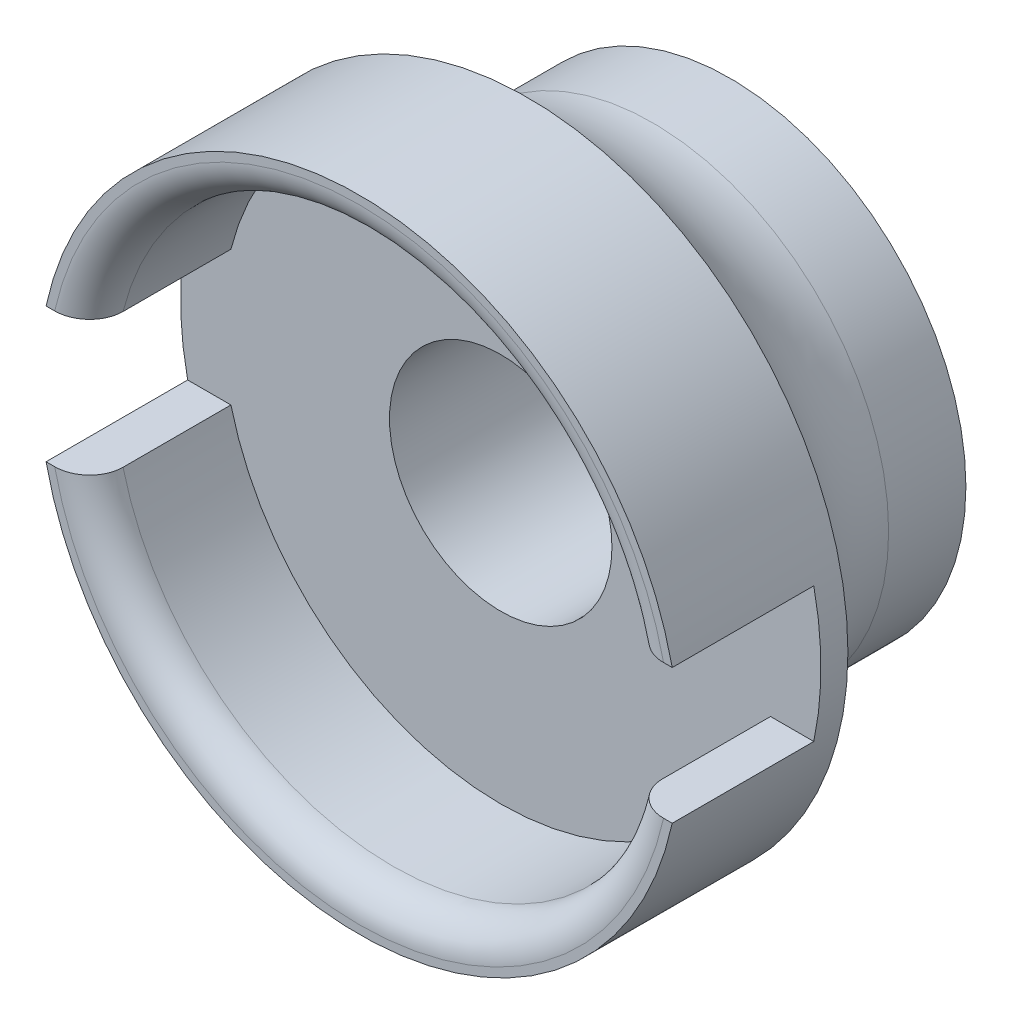
ISO-10303-21;
HEADER;
FILE_DESCRIPTION(('STEP AP214'),'2;1');
FILE_NAME('part.step','',(''),(''),'','','');
FILE_SCHEMA(('AUTOMOTIVE_DESIGN { 1 0 10303 214 1 1 1 1 }'));
ENDSEC;
DATA;
#1=APPLICATION_CONTEXT('core data for automotive mechanical design processes');
#2=APPLICATION_PROTOCOL_DEFINITION('international standard','automotive_design',2000,#1);
#3=PRODUCT_CONTEXT('',#1,'mechanical');
#4=PRODUCT('Part','Part','',(#3));
#5=PRODUCT_RELATED_PRODUCT_CATEGORY('part','',(#4));
#6=PRODUCT_DEFINITION_FORMATION('','',#4);
#7=PRODUCT_DEFINITION_CONTEXT('part definition',#1,'design');
#8=PRODUCT_DEFINITION('design','',#6,#7);
#9=PRODUCT_DEFINITION_SHAPE('','',#8);
#10=(LENGTH_UNIT() NAMED_UNIT(*) SI_UNIT(.MILLI.,.METRE.));
#11=(NAMED_UNIT(*) PLANE_ANGLE_UNIT() SI_UNIT($,.RADIAN.));
#12=(NAMED_UNIT(*) SI_UNIT($,.STERADIAN.) SOLID_ANGLE_UNIT());
#13=UNCERTAINTY_MEASURE_WITH_UNIT(LENGTH_MEASURE(1.E-05),#10,'distance_accuracy_value','');
#14=(GEOMETRIC_REPRESENTATION_CONTEXT(3) GLOBAL_UNCERTAINTY_ASSIGNED_CONTEXT((#13)) GLOBAL_UNIT_ASSIGNED_CONTEXT((#10,
#11,#12)) REPRESENTATION_CONTEXT('',''));
#15=CARTESIAN_POINT('',(0.,0.,0.));
#16=DIRECTION('',(0.,0.,1.));
#17=DIRECTION('',(1.,0.,0.));
#18=AXIS2_PLACEMENT_3D('',#15,#16,#17);
#19=CARTESIAN_POINT('',(0.,0.,3.5));
#20=DIRECTION('',(0.,0.,-1.));
#21=DIRECTION('',(-1.,0.,0.));
#22=AXIS2_PLACEMENT_3D('',#19,#20,#21);
#23=CYLINDRICAL_SURFACE('',#22,4.75);
#24=CARTESIAN_POINT('',(0.,0.,1.));
#25=DIRECTION('',(0.,0.,1.));
#26=DIRECTION('',(1.,0.,0.));
#27=AXIS2_PLACEMENT_3D('',#24,#25,#26);
#28=CIRCLE('',#27,4.75);
#29=CARTESIAN_POINT('',(4.75,0.,1.));
#30=VERTEX_POINT('',#29);
#31=EDGE_CURVE('E173',#30,#30,#28,.T.);
#32=ORIENTED_EDGE('',*,*,#31,.T.);
#33=EDGE_LOOP('',(#32));
#34=FACE_BOUND('',#33,.T.);
#35=DIRECTION('',(0.,0.,-1.));
#36=VECTOR('',#35,1.);
#37=CARTESIAN_POINT('',(-4.64354390525168,1.,3.5));
#38=LINE('',#37,#36);
#39=CARTESIAN_POINT('',(-4.64354390525168,1.,3.5));
#40=VERTEX_POINT('',#39);
#41=CARTESIAN_POINT('',(-4.64354390525168,1.,1.4));
#42=VERTEX_POINT('',#41);
#43=EDGE_CURVE('E166',#40,#42,#38,.T.);
#44=ORIENTED_EDGE('',*,*,#43,.F.);
#45=CARTESIAN_POINT('',(0.,0.,3.5));
#46=DIRECTION('',(0.,0.,1.));
#47=DIRECTION('',(1.,0.,0.));
#48=AXIS2_PLACEMENT_3D('',#45,#46,#47);
#49=CIRCLE('',#48,4.75);
#50=CARTESIAN_POINT('',(4.64354390525168,1.,3.5));
#51=VERTEX_POINT('',#50);
#52=EDGE_CURVE('E175',#51,#40,#49,.T.);
#53=ORIENTED_EDGE('',*,*,#52,.F.);
#54=DIRECTION('',(0.,0.,-1.));
#55=VECTOR('',#54,1.);
#56=CARTESIAN_POINT('',(4.64354390525168,1.,3.5));
#57=LINE('',#56,#55);
#58=CARTESIAN_POINT('',(4.64354390525168,1.,1.4));
#59=VERTEX_POINT('',#58);
#60=EDGE_CURVE('E159',#59,#51,#57,.F.);
#61=ORIENTED_EDGE('',*,*,#60,.F.);
#62=CARTESIAN_POINT('',(0.,0.,1.4));
#63=DIRECTION('',(0.,0.,1.));
#64=DIRECTION('',(1.,0.,0.));
#65=AXIS2_PLACEMENT_3D('',#62,#63,#64);
#66=CIRCLE('',#65,4.75);
#67=CARTESIAN_POINT('',(4.64354390525168,-1.,1.4));
#68=VERTEX_POINT('',#67);
#69=EDGE_CURVE('E131',#68,#59,#66,.T.);
#70=ORIENTED_EDGE('',*,*,#69,.F.);
#71=DIRECTION('',(0.,0.,-1.));
#72=VECTOR('',#71,1.);
#73=CARTESIAN_POINT('',(4.64354390525168,-1.,3.5));
#74=LINE('',#73,#72);
#75=CARTESIAN_POINT('',(4.64354390525168,-1.,3.5));
#76=VERTEX_POINT('',#75);
#77=EDGE_CURVE('E256',#76,#68,#74,.T.);
#78=ORIENTED_EDGE('',*,*,#77,.F.);
#79=CARTESIAN_POINT('',(-4.64354390525168,-1.,3.5));
#80=VERTEX_POINT('',#79);
#81=EDGE_CURVE('E143',#80,#76,#49,.T.);
#82=ORIENTED_EDGE('',*,*,#81,.F.);
#83=DIRECTION('',(0.,0.,-1.));
#84=VECTOR('',#83,1.);
#85=CARTESIAN_POINT('',(-4.64354390525168,-1.,3.5));
#86=LINE('',#85,#84);
#87=CARTESIAN_POINT('',(-4.64354390525168,-1.,1.4));
#88=VERTEX_POINT('',#87);
#89=EDGE_CURVE('E134',#88,#80,#86,.F.);
#90=ORIENTED_EDGE('',*,*,#89,.F.);
#91=EDGE_CURVE('E118',#42,#88,#66,.T.);
#92=ORIENTED_EDGE('',*,*,#91,.F.);
#93=EDGE_LOOP('',(#44,#53,#61,#70,#78,#82,#90,#92));
#94=FACE_BOUND('',#93,.T.);
#95=ADVANCED_FACE('F39',(#34,#94),#23,.T.);
#96=CARTESIAN_POINT('',(0.,0.,3.5));
#97=DIRECTION('',(0.,0.,1.));
#98=DIRECTION('',(1.,0.,0.));
#99=AXIS2_PLACEMENT_3D('',#96,#97,#98);
#100=PLANE('',#99);
#101=ORIENTED_EDGE('',*,*,#52,.T.);
#102=DIRECTION('',(1.,0.,0.));
#103=VECTOR('',#102,1.);
#104=CARTESIAN_POINT('',(0.,1.,3.5));
#105=LINE('',#104,#103);
#106=CARTESIAN_POINT('',(-4.51559796704712,1.,3.50000000000016));
#107=VERTEX_POINT('',#106);
#108=EDGE_CURVE('E160',#40,#107,#105,.T.);
#109=ORIENTED_EDGE('',*,*,#108,.T.);
#110=CARTESIAN_POINT('',(0.,0.,3.5));
#111=DIRECTION('',(0.,0.,1.));
#112=DIRECTION('',(1.,0.,0.));
#113=AXIS2_PLACEMENT_3D('',#110,#111,#112);
#114=CIRCLE('',#113,4.625);
#115=CARTESIAN_POINT('',(4.51559796704711,1.,3.5));
#116=VERTEX_POINT('',#115);
#117=EDGE_CURVE('E195',#107,#116,#114,.F.);
#118=ORIENTED_EDGE('',*,*,#117,.T.);
#119=EDGE_CURVE('E149',#116,#51,#105,.T.);
#120=ORIENTED_EDGE('',*,*,#119,.T.);
#121=EDGE_LOOP('',(#101,#109,#118,#120));
#122=FACE_BOUND('',#121,.T.);
#123=ADVANCED_FACE('F279',(#122),#100,.T.);
#124=ORIENTED_EDGE('',*,*,#81,.T.);
#125=DIRECTION('',(-1.,0.,0.));
#126=VECTOR('',#125,1.);
#127=CARTESIAN_POINT('',(0.,-1.,3.5));
#128=LINE('',#127,#126);
#129=CARTESIAN_POINT('',(4.51559796704712,-1.,3.5000000000001));
#130=VERTEX_POINT('',#129);
#131=EDGE_CURVE('E152',#76,#130,#128,.T.);
#132=ORIENTED_EDGE('',*,*,#131,.T.);
#133=CARTESIAN_POINT('',(-4.51559796704711,-1.,3.5));
#134=VERTEX_POINT('',#133);
#135=EDGE_CURVE('E196',#130,#134,#114,.F.);
#136=ORIENTED_EDGE('',*,*,#135,.T.);
#137=EDGE_CURVE('E63',#134,#80,#128,.T.);
#138=ORIENTED_EDGE('',*,*,#137,.T.);
#139=EDGE_LOOP('',(#124,#132,#136,#138));
#140=FACE_BOUND('',#139,.T.);
#141=ADVANCED_FACE('F254',(#140),#100,.T.);
#142=CARTESIAN_POINT('',(0.,0.,1.4));
#143=DIRECTION('',(0.,0.,1.));
#144=DIRECTION('',(1.,0.,0.));
#145=AXIS2_PLACEMENT_3D('',#142,#143,#144);
#146=CYLINDRICAL_SURFACE('',#145,4.125);
#147=DIRECTION('',(0.,0.,1.));
#148=VECTOR('',#147,1.);
#149=CARTESIAN_POINT('',(4.00195264839553,1.,1.4));
#150=LINE('',#149,#148);
#151=CARTESIAN_POINT('',(4.00195264839553,1.,3.));
#152=VERTEX_POINT('',#151);
#153=CARTESIAN_POINT('',(4.00195264839553,1.,1.4));
#154=VERTEX_POINT('',#153);
#155=EDGE_CURVE('E145',#152,#154,#150,.F.);
#156=ORIENTED_EDGE('',*,*,#155,.F.);
#157=CARTESIAN_POINT('',(0.,0.,3.));
#158=DIRECTION('',(0.,0.,1.));
#159=DIRECTION('',(1.,0.,0.));
#160=AXIS2_PLACEMENT_3D('',#157,#158,#159);
#161=CIRCLE('',#160,4.125);
#162=CARTESIAN_POINT('',(-4.00195264839549,1.,3.));
#163=VERTEX_POINT('',#162);
#164=EDGE_CURVE('E191',#152,#163,#161,.T.);
#165=ORIENTED_EDGE('',*,*,#164,.T.);
#166=DIRECTION('',(0.,0.,1.));
#167=VECTOR('',#166,1.);
#168=CARTESIAN_POINT('',(-4.00195264839553,1.,1.4));
#169=LINE('',#168,#167);
#170=CARTESIAN_POINT('',(-4.00195264839553,1.,1.4));
#171=VERTEX_POINT('',#170);
#172=EDGE_CURVE('E163',#171,#163,#169,.T.);
#173=ORIENTED_EDGE('',*,*,#172,.F.);
#174=CARTESIAN_POINT('',(0.,0.,1.4));
#175=DIRECTION('',(0.,0.,1.));
#176=DIRECTION('',(1.,0.,0.));
#177=AXIS2_PLACEMENT_3D('',#174,#175,#176);
#178=CIRCLE('',#177,4.125);
#179=EDGE_CURVE('E170',#154,#171,#178,.T.);
#180=ORIENTED_EDGE('',*,*,#179,.F.);
#181=EDGE_LOOP('',(#156,#165,#173,#180));
#182=FACE_BOUND('',#181,.T.);
#183=ADVANCED_FACE('F275',(#182),#146,.F.);
#184=DIRECTION('',(0.,0.,1.));
#185=VECTOR('',#184,1.);
#186=CARTESIAN_POINT('',(-4.00195264839553,-1.,1.4));
#187=LINE('',#186,#185);
#188=CARTESIAN_POINT('',(-4.00195264839448,-1.,2.99999999999998));
#189=VERTEX_POINT('',#188);
#190=CARTESIAN_POINT('',(-4.00195264839553,-1.,1.4));
#191=VERTEX_POINT('',#190);
#192=EDGE_CURVE('E136',#189,#191,#187,.F.);
#193=ORIENTED_EDGE('',*,*,#192,.F.);
#194=CARTESIAN_POINT('',(4.00195264839553,-1.,3.));
#195=VERTEX_POINT('',#194);
#196=EDGE_CURVE('E190',#189,#195,#161,.T.);
#197=ORIENTED_EDGE('',*,*,#196,.T.);
#198=DIRECTION('',(0.,0.,1.));
#199=VECTOR('',#198,1.);
#200=CARTESIAN_POINT('',(4.00195264839553,-1.,1.4));
#201=LINE('',#200,#199);
#202=CARTESIAN_POINT('',(4.00195264839553,-1.,1.4));
#203=VERTEX_POINT('',#202);
#204=EDGE_CURVE('E55',#203,#195,#201,.T.);
#205=ORIENTED_EDGE('',*,*,#204,.F.);
#206=EDGE_CURVE('E174',#191,#203,#178,.T.);
#207=ORIENTED_EDGE('',*,*,#206,.F.);
#208=EDGE_LOOP('',(#193,#197,#205,#207));
#209=FACE_BOUND('',#208,.T.);
#210=ADVANCED_FACE('F286',(#209),#146,.F.);
#211=CARTESIAN_POINT('',(0.,0.,3.));
#212=DIRECTION('',(0.,0.,1.));
#213=DIRECTION('',(1.,0.,0.));
#214=AXIS2_PLACEMENT_3D('',#211,#212,#213);
#215=TOROIDAL_SURFACE('',#214,4.625,0.5);
#216=ORIENTED_EDGE('',*,*,#117,.F.);
#217=CARTESIAN_POINT('',(-4.44735008386979,1.,3.49554329501855));
#218=CARTESIAN_POINT('',(-4.41831995392989,1.,3.49173502386112));
#219=CARTESIAN_POINT('',(-4.38958815719879,1.,3.48549070914064));
#220=CARTESIAN_POINT('',(-4.33354655231218,1.,3.46828281456044));
#221=CARTESIAN_POINT('',(-4.30623850241788,1.,3.45731354744562));
#222=CARTESIAN_POINT('',(-4.25385028446689,1.,3.43092982532924));
#223=CARTESIAN_POINT('',(-4.22877044757287,1.,3.41551471101537));
#224=CARTESIAN_POINT('',(-4.181606983845,1.,3.38064147107417));
#225=CARTESIAN_POINT('',(-4.15952244489273,1.,3.36118458082503));
#226=CARTESIAN_POINT('',(-4.11931561815197,1.,3.3190359890979));
#227=CARTESIAN_POINT('',(-4.10114375117739,1.,3.2963916306581));
#228=CARTESIAN_POINT('',(-4.0689873097533,1.,3.24830037555802));
#229=CARTESIAN_POINT('',(-4.05500223230814,1.,3.22285381605352));
#230=CARTESIAN_POINT('',(-4.03202898506533,1.,3.17063597968394));
#231=CARTESIAN_POINT('',(-4.02291337588099,1.,3.14392076424631));
#232=CARTESIAN_POINT('',(-4.00941809405874,1.,3.08932048464781));
#233=CARTESIAN_POINT('',(-4.00503765665245,1.,3.06143561015223));
#234=CARTESIAN_POINT('',(-4.00121282306982,1.,3.00598648581706));
#235=CARTESIAN_POINT('',(-4.00165547016488,1.,2.97842997121876));
#236=CARTESIAN_POINT('',(-4.00718909835075,1.,2.92378925327221));
#237=CARTESIAN_POINT('',(-4.01227982419925,1.,2.89670502407232));
#238=CARTESIAN_POINT('',(-4.02689660944263,1.,2.84391952545801));
#239=CARTESIAN_POINT('',(-4.0363989010841,1.,2.81821165849272));
#240=CARTESIAN_POINT('',(-4.05952069378308,1.,2.76872130833299));
#241=CARTESIAN_POINT('',(-4.07314044808723,1.,2.74493894368166));
#242=CARTESIAN_POINT('',(-4.1043150194922,1.,2.6995685368998));
#243=CARTESIAN_POINT('',(-4.12192734166754,1.,2.67802004014529));
#244=CARTESIAN_POINT('',(-4.16043300472458,1.,2.63808849360424));
#245=CARTESIAN_POINT('',(-4.18132676867201,1.,2.61970585262287));
#246=CARTESIAN_POINT('',(-4.22640303258572,1.,2.58610185316463));
#247=CARTESIAN_POINT('',(-4.2506589609105,1.,2.57097898908153));
#248=CARTESIAN_POINT('',(-4.3013187580394,1.,2.54490704484454));
#249=CARTESIAN_POINT('',(-4.32772291510545,1.,2.53395852595329));
#250=CARTESIAN_POINT('',(-4.38261981747788,1.,2.51628624024966));
#251=CARTESIAN_POINT('',(-4.41114771292036,1.,2.50967153397427));
#252=CARTESIAN_POINT('',(-4.46890660793105,1.,2.50126756956606));
#253=CARTESIAN_POINT('',(-4.49813766309314,1.,2.4994786942512));
#254=CARTESIAN_POINT('',(-4.55680836735425,1.,2.50079017737442));
#255=CARTESIAN_POINT('',(-4.58624685574699,1.,2.5039435949053));
#256=CARTESIAN_POINT('',(-4.64417049934313,1.,2.51517514299266));
#257=CARTESIAN_POINT('',(-4.67265566205143,1.,2.52325323477087));
#258=CARTESIAN_POINT('',(-4.72768423055946,1.,2.54408167357651));
#259=CARTESIAN_POINT('',(-4.75423755153576,1.,2.55680579435189));
#260=CARTESIAN_POINT('',(-4.8047791518283,1.,2.58660699028647));
#261=CARTESIAN_POINT('',(-4.82876764887384,1.,2.6036836955353));
#262=CARTESIAN_POINT('',(-4.87304706082735,1.,2.64139615643538));
#263=CARTESIAN_POINT('',(-4.89339482151552,1.,2.66196514693468));
#264=CARTESIAN_POINT('',(-4.9302588755661,1.,2.70629062690548));
#265=CARTESIAN_POINT('',(-4.94677561892912,1.,2.73004674149168));
#266=CARTESIAN_POINT('',(-4.97514816439494,1.,2.77954065858489));
#267=CARTESIAN_POINT('',(-4.98709360186384,1.,2.80522708844339));
#268=CARTESIAN_POINT('',(-5.00642122335944,1.,2.8582628471198));
#269=CARTESIAN_POINT('',(-5.01380387546068,1.,2.88561200505003));
#270=CARTESIAN_POINT('',(-5.02368680310943,1.,2.94071966253563));
#271=CARTESIAN_POINT('',(-5.02626430676253,1.,2.96846433339734));
#272=CARTESIAN_POINT('',(-5.02669129280416,1.,3.02398934907648));
#273=CARTESIAN_POINT('',(-5.02454101673291,1.,3.05176969199896));
#274=CARTESIAN_POINT('',(-5.01561018748594,1.,3.10639007346588));
#275=CARTESIAN_POINT('',(-5.00885961655945,1.,3.13323502467713));
#276=CARTESIAN_POINT('',(-4.99096913708682,1.,3.18541896588802));
#277=CARTESIAN_POINT('',(-4.97982918045595,1.,3.21075793938651));
#278=CARTESIAN_POINT('',(-4.95343277356827,1.,3.25935657082713));
#279=CARTESIAN_POINT('',(-4.93815586349042,1.,3.28260510789544));
#280=CARTESIAN_POINT('',(-4.90396969582811,1.,3.32625432916082));
#281=CARTESIAN_POINT('',(-4.88506035776866,1.,3.34665495024616));
#282=CARTESIAN_POINT('',(-4.84385538236226,1.,3.38436022513508));
#283=CARTESIAN_POINT('',(-4.8215138808962,1.,3.40161473556679));
#284=CARTESIAN_POINT('',(-4.77429258628128,1.,3.43221931974726));
#285=CARTESIAN_POINT('',(-4.74941192898773,1.,3.44556805823725));
#286=CARTESIAN_POINT('',(-4.69727952500204,1.,3.46826739079276));
#287=CARTESIAN_POINT('',(-4.66998946127678,1.,3.47752985379119));
#288=CARTESIAN_POINT('',(-4.61427816290542,1.,3.49142364482827));
#289=CARTESIAN_POINT('',(-4.58585814980353,1.,3.49605983980937));
#290=CARTESIAN_POINT('',(-4.5389631655515,1.,3.4998020446121));
#291=CARTESIAN_POINT('',(-4.52058759198285,1.,3.50029731424312));
#292=CARTESIAN_POINT('',(-4.4838855812283,1.,3.49936231410033));
#293=CARTESIAN_POINT('',(-4.46555914462682,1.,3.49793202152541));
#294=CARTESIAN_POINT('',(-4.44735008386979,1.,3.49554329501855));
#295=B_SPLINE_CURVE_WITH_KNOTS('',3,(#217,#218,#219,#220,#221,#222,#223,#224,#225,#226,#227,
#228,#229,#230,#231,#232,#233,#234,#235,#236,#237,#238,#239,#240,#241,#242,#243,#244,#245,#246,
#247,#248,#249,#250,#251,#252,#253,#254,#255,#256,#257,#258,#259,#260,#261,#262,#263,#264,#265,
#266,#267,#268,#269,#270,#271,#272,#273,#274,#275,#276,#277,#278,#279,#280,#281,#282,#283,#284,
#285,#286,#287,#288,#289,#290,#291,#292,#293,#294),.UNSPECIFIED.,.T.,.F.,(4,2,2,2,2,2,2,2,2,2,2,
2,2,2,2,2,2,2,2,2,2,2,2,2,2,2,2,2,2,2,2,2,2,2,2,2,2,2,4),(0.,0.087770438648908,
0.175646819931792,0.263536239854041,0.351398835594493,0.438072317631273,0.524735382641985,
0.609002895190719,0.693256795823272,0.775541792295173,0.857822270480779,0.93966450887402,
1.02151178204054,1.10462265058356,1.18774424315272,1.27310489099955,1.35847701198985,
1.44592249223388,1.53337490904803,1.62177264096718,1.71016967682648,1.79807524762778,
1.88597335014294,1.97234906413059,2.05871462707265,2.14328740231061,2.22785150018758,
2.31104436457835,2.3942329787804,2.47688453520305,2.55953699708007,2.64260593790308,
2.72567671929732,2.80997368078254,2.89429942712694,2.98036422347955,3.06633838188819,
3.1213914708156,3.17644521164754),.UNSPECIFIED.);
#296=EDGE_CURVE('E48',#107,#163,#295,.T.);
#297=ORIENTED_EDGE('',*,*,#296,.T.);
#298=ORIENTED_EDGE('',*,*,#164,.F.);
#299=CARTESIAN_POINT('',(4.04070669094372,1.,3.19024777535394));
#300=CARTESIAN_POINT('',(4.05172511251113,1.,3.21623976736984));
#301=CARTESIAN_POINT('',(4.06499450303563,1.,3.24130330191065));
#302=CARTESIAN_POINT('',(4.09559473481152,1.,3.28884645351158));
#303=CARTESIAN_POINT('',(4.11293164140136,1.,3.31132213630668));
#304=CARTESIAN_POINT('',(4.15107995375308,1.,3.35303107688713));
#305=CARTESIAN_POINT('',(4.17188553393384,1.,3.372269664257));
#306=CARTESIAN_POINT('',(4.21636626430811,1.,3.40705927532698));
#307=CARTESIAN_POINT('',(4.24004072501592,1.,3.42261118241113));
#308=CARTESIAN_POINT('',(4.29010978176293,1.,3.44993964700784));
#309=CARTESIAN_POINT('',(4.31655019578588,1.,3.461632263062));
#310=CARTESIAN_POINT('',(4.37099567216511,1.,3.48051062448784));
#311=CARTESIAN_POINT('',(4.39900098307592,1.,3.48769565168488));
#312=CARTESIAN_POINT('',(4.45636609340875,1.,3.49747292642331));
#313=CARTESIAN_POINT('',(4.48574165327066,1.,3.49997293955825));
#314=CARTESIAN_POINT('',(4.54449860595745,1.,3.50002662513771));
#315=CARTESIAN_POINT('',(4.573879998979,1.,3.49758008464265));
#316=CARTESIAN_POINT('',(4.63192207274033,1.,3.48776867293514));
#317=CARTESIAN_POINT('',(4.66057974399056,1.,3.48038594816829));
#318=CARTESIAN_POINT('',(4.71622565876957,1.,3.4608587125837));
#319=CARTESIAN_POINT('',(4.74321398150505,1.,3.44871442789185));
#320=CARTESIAN_POINT('',(4.7944127011999,1.,3.42014067377057));
#321=CARTESIAN_POINT('',(4.8186514613931,1.,3.40376206104699));
#322=CARTESIAN_POINT('',(4.8639630876955,1.,3.36709106253312));
#323=CARTESIAN_POINT('',(4.88503628269468,1.,3.34679908382745));
#324=CARTESIAN_POINT('',(4.92296839985539,1.,3.30330784546322));
#325=CARTESIAN_POINT('',(4.93990275683192,1.,3.28017438408421));
#326=CARTESIAN_POINT('',(4.96955519255925,1.,3.23134651400026));
#327=CARTESIAN_POINT('',(4.982273763718,1.,3.20565240483781));
#328=CARTESIAN_POINT('',(5.00287837548664,1.,3.1529776981364));
#329=CARTESIAN_POINT('',(5.01085449814105,1.,3.12603231905446));
#330=CARTESIAN_POINT('',(5.02210576298657,1.,3.07117769889841));
#331=CARTESIAN_POINT('',(5.0253812958874,1.,3.04326853813067));
#332=CARTESIAN_POINT('',(5.02711591693125,1.,2.98765054078926));
#333=CARTESIAN_POINT('',(5.02563451591008,1.,2.95994354179425));
#334=CARTESIAN_POINT('',(5.01803252463846,1.,2.90517442529538));
#335=CARTESIAN_POINT('',(5.01191205879227,1.,2.87811229051848));
#336=CARTESIAN_POINT('',(4.99523614961741,1.,2.82543817088175));
#337=CARTESIAN_POINT('',(4.98468752039079,1.,2.79982402626489));
#338=CARTESIAN_POINT('',(4.95947925865173,1.,2.75070703365312));
#339=CARTESIAN_POINT('',(4.94481949080044,1.,2.7272042551981));
#340=CARTESIAN_POINT('',(4.91166714948464,1.,2.68272554005135));
#341=CARTESIAN_POINT('',(4.89313903498081,1.,2.66177610855153));
#342=CARTESIAN_POINT('',(4.8528841084199,1.,2.62321847338621));
#343=CARTESIAN_POINT('',(4.83115703862351,1.,2.6056105392065));
#344=CARTESIAN_POINT('',(4.78471075136493,1.,2.5738954474691));
#345=CARTESIAN_POINT('',(4.75994505419319,1.,2.55985637528544));
#346=CARTESIAN_POINT('',(4.70844361462616,1.,2.53603979835021));
#347=CARTESIAN_POINT('',(4.68170766255985,1.,2.52626274792325));
#348=CARTESIAN_POINT('',(4.6264409592148,1.,2.51104235729523));
#349=CARTESIAN_POINT('',(4.59788470922702,1.,2.50569156920457));
#350=CARTESIAN_POINT('',(4.5402802517259,1.,2.49978011096241));
#351=CARTESIAN_POINT('',(4.51123199647694,1.,2.49921990830435));
#352=CARTESIAN_POINT('',(4.45299380895426,1.,2.50291920387169));
#353=CARTESIAN_POINT('',(4.42380856839983,1.,2.50725295845585));
#354=CARTESIAN_POINT('',(4.36657316980849,1.,2.52074381250108));
#355=CARTESIAN_POINT('',(4.33852306765174,1.,2.52990114910532));
#356=CARTESIAN_POINT('',(4.28429060876851,1.,2.55283572596557));
#357=CARTESIAN_POINT('',(4.25811331557803,1.,2.56662495643294));
#358=CARTESIAN_POINT('',(4.20848840514895,1.,2.59846240924907));
#359=CARTESIAN_POINT('',(4.18504064676676,1.,2.61651041123157));
#360=CARTESIAN_POINT('',(4.14191798001253,1.,2.65610025978234));
#361=CARTESIAN_POINT('',(4.12219422752287,1.,2.67758885758419));
#362=CARTESIAN_POINT('',(4.08675392986335,1.,2.72364950832021));
#363=CARTESIAN_POINT('',(4.07103659659804,1.,2.74822095341188));
#364=CARTESIAN_POINT('',(4.04450767480443,1.,2.79904781438714));
#365=CARTESIAN_POINT('',(4.0335761154327,1.,2.82524060983084));
#366=CARTESIAN_POINT('',(4.01639395767547,1.,2.87912707639431));
#367=CARTESIAN_POINT('',(4.010143804067,1.,2.90682088985676));
#368=CARTESIAN_POINT('',(4.00264500191988,1.,2.96216849577681));
#369=CARTESIAN_POINT('',(4.00127537463336,1.,2.98980602383698));
#370=CARTESIAN_POINT('',(4.00325040613461,1.,3.04488683857587));
#371=CARTESIAN_POINT('',(4.0065886854172,1.,3.07233033756053));
#372=CARTESIAN_POINT('',(4.01546471896442,1.,3.11485640867465));
#373=CARTESIAN_POINT('',(4.01948182532252,1.,3.13027239959229));
#374=CARTESIAN_POINT('',(4.02899630519574,1.,3.16063991453098));
#375=CARTESIAN_POINT('',(4.03449364022805,1.,3.17559145061559));
#376=CARTESIAN_POINT('',(4.04070669094372,1.,3.19024777535394));
#377=B_SPLINE_CURVE_WITH_KNOTS('',3,(#299,#300,#301,#302,#303,#304,#305,#306,#307,#308,#309,
#310,#311,#312,#313,#314,#315,#316,#317,#318,#319,#320,#321,#322,#323,#324,#325,#326,#327,#328,
#329,#330,#331,#332,#333,#334,#335,#336,#337,#338,#339,#340,#341,#342,#343,#344,#345,#346,#347,
#348,#349,#350,#351,#352,#353,#354,#355,#356,#357,#358,#359,#360,#361,#362,#363,#364,#365,#366,
#367,#368,#369,#370,#371,#372,#373,#374,#375,#376),.UNSPECIFIED.,.T.,.F.,(4,2,2,2,2,2,2,2,2,2,2,
2,2,2,2,2,2,2,2,2,2,2,2,2,2,2,2,2,2,2,2,2,2,2,2,2,2,2,4),(0.,0.0846328774454474,0.1693927677293,
0.254011713291926,0.33861036234108,0.42494349654746,0.511290382348183,0.599320024106587,
0.68735345545167,0.775707027521638,0.864056404199578,0.951390324377564,1.03871516461358,
1.12430441372825,1.20988366240855,1.29378061229163,1.37767058831492,1.46051518067689,
1.54335755150147,1.62607290826945,1.70879098834984,1.79230542507276,1.87582659422625,
1.96083833767805,2.04585914102912,2.13261572694868,2.21938077898874,2.30748022095947,
2.39558399459302,2.48391761585724,2.57224666738048,2.65932151308258,2.74637921720917,
2.83110836534937,2.91584556252504,2.99846708614912,3.08097676000107,3.12870065820409,
3.17642331580657),.UNSPECIFIED.);
#378=EDGE_CURVE('E231',#152,#116,#377,.T.);
#379=ORIENTED_EDGE('',*,*,#378,.T.);
#380=EDGE_LOOP('',(#216,#297,#298,#379));
#381=FACE_BOUND('',#380,.T.);
#382=ADVANCED_FACE('F215',(#381),#215,.T.);
#383=ORIENTED_EDGE('',*,*,#196,.F.);
#384=CARTESIAN_POINT('',(-4.44735008386979,-1.,3.49554329501855));
#385=CARTESIAN_POINT('',(-4.47644371095707,-1.,3.49935750804576));
#386=CARTESIAN_POINT('',(-4.50587917996565,-1.,3.50073054190786));
#387=CARTESIAN_POINT('',(-4.56459111960175,-1.,3.49853385737663));
#388=CARTESIAN_POINT('',(-4.59386735025224,-1.,3.49495805996922));
#389=CARTESIAN_POINT('',(-4.65140484440593,-1.,3.4829307194652));
#390=CARTESIAN_POINT('',(-4.67966612947656,-1.,3.47447928004038));
#391=CARTESIAN_POINT('',(-4.73433849431407,-1.,3.45290527117736));
#392=CARTESIAN_POINT('',(-4.76075012723719,-1.,3.4397841054666));
#393=CARTESIAN_POINT('',(-4.81068391241392,-1.,3.40936283390888));
#394=CARTESIAN_POINT('',(-4.83423243126514,-1.,3.39210604218369));
#395=CARTESIAN_POINT('',(-4.87802261555804,-1.,3.35380778645807));
#396=CARTESIAN_POINT('',(-4.89826448167645,-1.,3.33276655229382));
#397=CARTESIAN_POINT('',(-4.93442614606789,-1.,3.28795369820484));
#398=CARTESIAN_POINT('',(-4.95042522017314,-1.,3.26424605245827));
#399=CARTESIAN_POINT('',(-4.97812476039578,-1.,3.21443986864779));
#400=CARTESIAN_POINT('',(-4.98982573513463,-1.,3.18834161393681));
#401=CARTESIAN_POINT('',(-5.00837097345605,-1.,3.13503423387315));
#402=CARTESIAN_POINT('',(-5.0153039482723,-1.,3.1078559507037));
#403=CARTESIAN_POINT('',(-5.02445003198035,-1.,3.0527169651532));
#404=CARTESIAN_POINT('',(-5.02666351468331,-1.,3.02475632491712));
#405=CARTESIAN_POINT('',(-5.02630245551442,-1.,2.96918534920728));
#406=CARTESIAN_POINT('',(-5.02378205616397,-1.,2.94157464476051));
#407=CARTESIAN_POINT('',(-5.01413927722358,-1.,2.88716988309778));
#408=CARTESIAN_POINT('',(-5.00701698499562,-1.,2.86037581038905));
#409=CARTESIAN_POINT('',(-4.98839430630637,-1.,2.80836406121542));
#410=CARTESIAN_POINT('',(-4.97689499392025,-1.,2.78314599977977));
#411=CARTESIAN_POINT('',(-4.94986899033711,-1.,2.73497067500585));
#412=CARTESIAN_POINT('',(-4.93434214375232,-1.,2.71201349894277));
#413=CARTESIAN_POINT('',(-4.89953551340028,-1.,2.6687385453745));
#414=CARTESIAN_POINT('',(-4.88021722048962,-1.,2.64845175718612));
#415=CARTESIAN_POINT('',(-4.83850377440933,-1.,2.61133811249481));
#416=CARTESIAN_POINT('',(-4.81610835987765,-1.,2.59451155019714));
#417=CARTESIAN_POINT('',(-4.76843810114386,-1.,2.56446077433037));
#418=CARTESIAN_POINT('',(-4.74311774529823,-1.,2.55130877169205));
#419=CARTESIAN_POINT('',(-4.69066005898868,-1.,2.52934600554097));
#420=CARTESIAN_POINT('',(-4.66352253424634,-1.,2.52053570705596));
#421=CARTESIAN_POINT('',(-4.60761296219743,-1.,2.50732529330737));
#422=CARTESIAN_POINT('',(-4.57881894067076,-1.,2.50301812569769));
#423=CARTESIAN_POINT('',(-4.52091449353944,-1.,2.49922407096837));
#424=CARTESIAN_POINT('',(-4.49180403798545,-1.,2.49973764415284));
#425=CARTESIAN_POINT('',(-4.43365175028126,-1.,2.50560272226384));
#426=CARTESIAN_POINT('',(-4.40461686890909,-1.,2.51102339374043));
#427=CARTESIAN_POINT('',(-4.34786514831088,-1.,2.52665641584226));
#428=CARTESIAN_POINT('',(-4.32014835910906,-1.,2.53686894816862));
#429=CARTESIAN_POINT('',(-4.26681101628864,-1.,2.56183571012967));
#430=CARTESIAN_POINT('',(-4.24119221679533,-1.,2.57659369210541));
#431=CARTESIAN_POINT('',(-4.19284755102208,-1.,2.61026695264156));
#432=CARTESIAN_POINT('',(-4.17012149519072,-1.,2.629181958585));
#433=CARTESIAN_POINT('',(-4.12861734256983,-1.,2.67032767616838));
#434=CARTESIAN_POINT('',(-4.10978188508161,-1.,2.69250048061036));
#435=CARTESIAN_POINT('',(-4.0762256857262,-1.,2.73976852527102));
#436=CARTESIAN_POINT('',(-4.06150426702912,-1.,2.76486328381467));
#437=CARTESIAN_POINT('',(-4.03702465457457,-1.,2.81652885894878));
#438=CARTESIAN_POINT('',(-4.02714193191622,-1.,2.84304067314368));
#439=CARTESIAN_POINT('',(-4.01209361430101,-1.,2.89737041555429));
#440=CARTESIAN_POINT('',(-4.00692725699549,-1.,2.92518813192068));
#441=CARTESIAN_POINT('',(-4.00156100637837,-1.,2.98061337293376));
#442=CARTESIAN_POINT('',(-4.00124337517594,-1.,3.00820955408156));
#443=CARTESIAN_POINT('',(-4.00528271509848,-1.,3.06305625888406));
#444=CARTESIAN_POINT('',(-4.00963940467129,-1.,3.09030680325773));
#445=CARTESIAN_POINT('',(-4.02283069590176,-1.,3.14349465841378));
#446=CARTESIAN_POINT('',(-4.03163352951144,-1.,3.16943986943552));
#447=CARTESIAN_POINT('',(-4.05341115935895,-1.,3.21951279491238));
#448=CARTESIAN_POINT('',(-4.06638600494714,-1.,3.2436404878641));
#449=CARTESIAN_POINT('',(-4.09630945458435,-1.,3.28976725804039));
#450=CARTESIAN_POINT('',(-4.11331071087501,-1.,3.3117321447653));
#451=CARTESIAN_POINT('',(-4.15067670559146,-1.,3.35259462658654));
#452=CARTESIAN_POINT('',(-4.17104268654523,-1.,3.37149108344018));
#453=CARTESIAN_POINT('',(-4.21513947036394,-1.,3.40621522180354));
#454=CARTESIAN_POINT('',(-4.23894627488969,-1.,3.42194627398635));
#455=CARTESIAN_POINT('',(-4.28879431906456,-1.,3.44928659778886));
#456=CARTESIAN_POINT('',(-4.31483323864796,-1.,3.46090008622753));
#457=CARTESIAN_POINT('',(-4.35874834470869,-1.,3.47634291340618));
#458=CARTESIAN_POINT('',(-4.37618043946747,-1.,3.48146899386076));
#459=CARTESIAN_POINT('',(-4.41148143044091,-1.,3.48988930421711));
#460=CARTESIAN_POINT('',(-4.42935033384171,-1.,3.49318350396062));
#461=CARTESIAN_POINT('',(-4.44735008386979,-1.,3.49554329501855));
#462=B_SPLINE_CURVE_WITH_KNOTS('',3,(#384,#385,#386,#387,#388,#389,#390,#391,#392,#393,#394,
#395,#396,#397,#398,#399,#400,#401,#402,#403,#404,#405,#406,#407,#408,#409,#410,#411,#412,#413,
#414,#415,#416,#417,#418,#419,#420,#421,#422,#423,#424,#425,#426,#427,#428,#429,#430,#431,#432,
#433,#434,#435,#436,#437,#438,#439,#440,#441,#442,#443,#444,#445,#446,#447,#448,#449,#450,#451,
#452,#453,#454,#455,#456,#457,#458,#459,#460,#461),.UNSPECIFIED.,.T.,.F.,(4,2,2,2,2,2,2,2,2,2,2,
2,2,2,2,2,2,2,2,2,2,2,2,2,2,2,2,2,2,2,2,2,2,2,2,2,2,2,4),(0.,0.0879621497327097,
0.176032445809391,0.264100869298026,0.352142841602474,0.439300180294514,0.526452227546855,
0.611838092292131,0.697213849526833,0.780954734102275,0.864688985667286,0.947471376137437,
1.0302521951193,1.1130127136327,1.19577642563529,1.27942886457855,1.36308841312174,
1.4482918724112,1.53350445562167,1.62044310613874,1.70739005799921,1.79558195829177,
1.88377720297647,1.97204545026938,2.06030791067057,2.14715786410095,2.23399352080264,
2.31845846833162,2.40290976061121,2.48530703281816,2.56769934220197,2.64951110835444,
2.73132384228631,2.81427204946717,2.89725095657123,2.98247023076549,3.0676019776316,
3.12202182146009,3.17644256117646),.UNSPECIFIED.);
#463=EDGE_CURVE('E210',#189,#134,#462,.T.);
#464=ORIENTED_EDGE('',*,*,#463,.T.);
#465=ORIENTED_EDGE('',*,*,#135,.F.);
#466=CARTESIAN_POINT('',(4.04070669094372,-1.,3.19024777535394));
#467=CARTESIAN_POINT('',(4.03003044637049,-1.,3.16505637750723));
#468=CARTESIAN_POINT('',(4.02145254686783,-1.,3.13895670061737));
#469=CARTESIAN_POINT('',(4.00879094376601,-1.,3.08566952024858));
#470=CARTESIAN_POINT('',(4.00471146812355,-1.,3.05848101823402));
#471=CARTESIAN_POINT('',(4.00119523488474,-1.,3.00380596459796));
#472=CARTESIAN_POINT('',(4.001757938235,-1.,2.97631944795233));
#473=CARTESIAN_POINT('',(4.00750628214886,-1.,2.92184092087573));
#474=CARTESIAN_POINT('',(4.01269103515974,-1.,2.89484881652037));
#475=CARTESIAN_POINT('',(4.02748619050315,-1.,2.84218621336755));
#476=CARTESIAN_POINT('',(4.03708475492256,-1.,2.81651238241433));
#477=CARTESIAN_POINT('',(4.06039158924982,-1.,2.76710459918625));
#478=CARTESIAN_POINT('',(4.07410021880859,-1.,2.74337081690657));
#479=CARTESIAN_POINT('',(4.10544671982185,-1.,2.69810750502095));
#480=CARTESIAN_POINT('',(4.12314261669441,-1.,2.6766181926032));
#481=CARTESIAN_POINT('',(4.16180447942923,-1.,2.63681768795754));
#482=CARTESIAN_POINT('',(4.18277086710393,-1.,2.61850690632605));
#483=CARTESIAN_POINT('',(4.22798273508843,-1.,2.58505856923508));
#484=CARTESIAN_POINT('',(4.25230143923519,-1.,2.57001998678425));
#485=CARTESIAN_POINT('',(4.30307230512247,-1.,2.54412621714936));
#486=CARTESIAN_POINT('',(4.32952474903254,-1.,2.53327158435863));
#487=CARTESIAN_POINT('',(4.38450073302671,-1.,2.51579780261409));
#488=CARTESIAN_POINT('',(4.4130588889655,-1.,2.50928743067658));
#489=CARTESIAN_POINT('',(4.47086066161593,-1.,2.50109664039605));
#490=CARTESIAN_POINT('',(4.50010433252764,-1.,2.4994166052697));
#491=CARTESIAN_POINT('',(4.55877654963725,-1.,2.50094878157874));
#492=CARTESIAN_POINT('',(4.58820375822238,-1.,2.5042131693));
#493=CARTESIAN_POINT('',(4.64608601097741,-1.,2.51566403479453));
#494=CARTESIAN_POINT('',(4.67454106411788,-1.,2.52385046713656));
#495=CARTESIAN_POINT('',(4.72948648564142,-1.,2.5448875969547));
#496=CARTESIAN_POINT('',(4.75598717323301,-1.,2.55771131152475));
#497=CARTESIAN_POINT('',(4.80640697163298,-1.,2.58770162877302));
#498=CARTESIAN_POINT('',(4.83032630266815,-1.,2.60486786055362));
#499=CARTESIAN_POINT('',(4.87445197011831,-1.,2.64274332630026));
#500=CARTESIAN_POINT('',(4.89471569050196,-1.,2.66338568649231));
#501=CARTESIAN_POINT('',(4.93140034054817,-1.,2.70784235484213));
#502=CARTESIAN_POINT('',(4.94782172341515,-1.,2.73165628839175));
#503=CARTESIAN_POINT('',(4.97599740192742,-1.,2.78124757679037));
#504=CARTESIAN_POINT('',(4.98784146168861,-1.,2.80697394282404));
#505=CARTESIAN_POINT('',(5.00696143531759,-1.,2.860071572959));
#506=CARTESIAN_POINT('',(5.01423781141629,-1.,2.88744267031295));
#507=CARTESIAN_POINT('',(5.02390890434513,-1.,2.94257778364569));
#508=CARTESIAN_POINT('',(5.02638046245617,-1.,2.97032834236985));
#509=CARTESIAN_POINT('',(5.02659671216223,-1.,3.02584713759236));
#510=CARTESIAN_POINT('',(5.02434164942317,-1.,3.05361537309697));
#511=CARTESIAN_POINT('',(5.01520578409669,-1.,3.10819787104159));
#512=CARTESIAN_POINT('',(5.00835434670782,-1.,3.13501705869982));
#513=CARTESIAN_POINT('',(4.99026844093403,-1.,3.1871331621717));
#514=CARTESIAN_POINT('',(4.97903393289588,-1.,3.21243006421099));
#515=CARTESIAN_POINT('',(4.9524555434116,-1.,3.26093223492108));
#516=CARTESIAN_POINT('',(4.93709081555887,-1.,3.28412607187352));
#517=CARTESIAN_POINT('',(4.90273903540969,-1.,3.32765334695747));
#518=CARTESIAN_POINT('',(4.88375175924383,-1.,3.34798660817364));
#519=CARTESIAN_POINT('',(4.8423980522947,-1.,3.38554814605909));
#520=CARTESIAN_POINT('',(4.81998534066631,-1.,3.40272545050319));
#521=CARTESIAN_POINT('',(4.77264151518229,-1.,3.43316093965077));
#522=CARTESIAN_POINT('',(4.7477101475635,-1.,3.44641872892037));
#523=CARTESIAN_POINT('',(4.69549990325883,-1.,3.4689226040726));
#524=CARTESIAN_POINT('',(4.66818381059339,-1.,3.47808234797474));
#525=CARTESIAN_POINT('',(4.61241627710872,-1.,3.49177892443929));
#526=CARTESIAN_POINT('',(4.58396471418199,-1.,3.49631525840449));
#527=CARTESIAN_POINT('',(4.52617201225347,-1.,3.50070908210646));
#528=CARTESIAN_POINT('',(4.49682415354068,-1.,3.5004784636665));
#529=CARTESIAN_POINT('',(4.43857526772227,-1.,3.49514015221022));
#530=CARTESIAN_POINT('',(4.4096742574512,-1.,3.49003227590117));
#531=CARTESIAN_POINT('',(4.35287990931031,-1.,3.47500861251509));
#532=CARTESIAN_POINT('',(4.32499746833427,-1.,3.46505156260535));
#533=CARTESIAN_POINT('',(4.27130804451008,-1.,3.44056267946717));
#534=CARTESIAN_POINT('',(4.24550156265078,-1.,3.42602974607949));
#535=CARTESIAN_POINT('',(4.19691194478506,-1.,3.39288090407325));
#536=CARTESIAN_POINT('',(4.1741098419171,-1.,3.37429279445205));
#537=CARTESIAN_POINT('',(4.13206236419107,-1.,3.33348477185939));
#538=CARTESIAN_POINT('',(4.11281226403091,-1.,3.31126975912347));
#539=CARTESIAN_POINT('',(4.08470817506225,-1.,3.27243941282612));
#540=CARTESIAN_POINT('',(4.07461309157653,-1.,3.25670721403892));
#541=CARTESIAN_POINT('',(4.05625519791867,-1.,3.22420691481293));
#542=CARTESIAN_POINT('',(4.04799235093233,-1.,3.20743883519621));
#543=CARTESIAN_POINT('',(4.04070669094372,-1.,3.19024777535394));
#544=B_SPLINE_CURVE_WITH_KNOTS('',3,(#466,#467,#468,#469,#470,#471,#472,#473,#474,#475,#476,
#477,#478,#479,#480,#481,#482,#483,#484,#485,#486,#487,#488,#489,#490,#491,#492,#493,#494,#495,
#496,#497,#498,#499,#500,#501,#502,#503,#504,#505,#506,#507,#508,#509,#510,#511,#512,#513,#514,
#515,#516,#517,#518,#519,#520,#521,#522,#523,#524,#525,#526,#527,#528,#529,#530,#531,#532,#533,
#534,#535,#536,#537,#538,#539,#540,#541,#542,#543),.UNSPECIFIED.,.T.,.F.,(4,2,2,2,2,2,2,2,2,2,2,
2,2,2,2,2,2,2,2,2,2,2,2,2,2,2,2,2,2,2,2,2,2,2,2,2,2,2,4),(0.,0.0820140264359529,
0.164105070287712,0.246186581798853,0.328252334937576,0.410099258742157,0.491953346646496,
0.575085886719509,0.658229157713401,0.743616245035205,0.829014642668072,0.916478271577247,
1.00394883925665,1.09234889719769,1.18074813920496,1.2686410786838,1.3565265136945,
1.44288214170898,1.52922757892033,1.6137815110569,1.69832688530109,1.7815086652505,
1.86468612193762,1.94733717420529,2.02998897422664,2.11306603988961,2.19614824128539,
2.280472704438,2.36480567205587,2.4508402342163,2.53688407352418,2.62451967056806,
2.71215856118394,2.80055657903164,2.88897586626961,2.97680707159395,3.06452057732401,
3.12048953850038,3.17645737501923),.UNSPECIFIED.);
#545=EDGE_CURVE('E200',#130,#195,#544,.T.);
#546=ORIENTED_EDGE('',*,*,#545,.T.);
#547=EDGE_LOOP('',(#383,#464,#465,#546));
#548=FACE_BOUND('',#547,.T.);
#549=ADVANCED_FACE('F250',(#548),#215,.T.);
#550=CARTESIAN_POINT('',(0.,0.,-2.));
#551=DIRECTION('',(0.,0.,1.));
#552=DIRECTION('',(1.,0.,0.));
#553=AXIS2_PLACEMENT_3D('',#550,#551,#552);
#554=CYLINDRICAL_SURFACE('',#553,3.5);
#555=CARTESIAN_POINT('',(0.,0.,-0.854049621773916));
#556=DIRECTION('',(0.,0.,1.));
#557=DIRECTION('',(1.,0.,0.));
#558=AXIS2_PLACEMENT_3D('',#555,#556,#557);
#559=CIRCLE('',#558,3.5);
#560=CARTESIAN_POINT('',(3.5,0.,-0.854049621773916));
#561=VERTEX_POINT('',#560);
#562=EDGE_CURVE('E11',#561,#561,#559,.F.);
#563=ORIENTED_EDGE('',*,*,#562,.T.);
#564=EDGE_LOOP('',(#563));
#565=FACE_BOUND('',#564,.T.);
#566=CARTESIAN_POINT('',(0.,0.,-2.));
#567=DIRECTION('',(0.,0.,1.));
#568=DIRECTION('',(1.,0.,0.));
#569=AXIS2_PLACEMENT_3D('',#566,#567,#568);
#570=CIRCLE('',#569,3.5);
#571=CARTESIAN_POINT('',(3.5,0.,-2.));
#572=VERTEX_POINT('',#571);
#573=EDGE_CURVE('E186',#572,#572,#570,.T.);
#574=ORIENTED_EDGE('',*,*,#573,.T.);
#575=EDGE_LOOP('',(#574));
#576=FACE_BOUND('',#575,.T.);
#577=ADVANCED_FACE('F307',(#565,#576),#554,.T.);
#578=CARTESIAN_POINT('',(0.,0.,-2.));
#579=DIRECTION('',(0.,0.,1.));
#580=DIRECTION('',(1.,0.,0.));
#581=AXIS2_PLACEMENT_3D('',#578,#579,#580);
#582=PLANE('',#581);
#583=CARTESIAN_POINT('',(0.,0.,-2.));
#584=DIRECTION('',(0.,0.,1.));
#585=DIRECTION('',(1.,0.,0.));
#586=AXIS2_PLACEMENT_3D('',#583,#584,#585);
#587=CIRCLE('',#586,1.65);
#588=CARTESIAN_POINT('',(1.65,0.,-2.));
#589=VERTEX_POINT('',#588);
#590=EDGE_CURVE('E179',#589,#589,#587,.T.);
#591=ORIENTED_EDGE('',*,*,#590,.T.);
#592=EDGE_LOOP('',(#591));
#593=FACE_BOUND('',#592,.T.);
#594=ORIENTED_EDGE('',*,*,#573,.F.);
#595=EDGE_LOOP('',(#594));
#596=FACE_BOUND('',#595,.T.);
#597=ADVANCED_FACE('F304',(#593,#596),#582,.F.);
#598=CARTESIAN_POINT('',(0.,0.,-2.));
#599=DIRECTION('',(0.,0.,1.));
#600=DIRECTION('',(1.,0.,0.));
#601=AXIS2_PLACEMENT_3D('',#598,#599,#600);
#602=CYLINDRICAL_SURFACE('',#601,1.65);
#603=ORIENTED_EDGE('',*,*,#590,.F.);
#604=EDGE_LOOP('',(#603));
#605=FACE_BOUND('',#604,.T.);
#606=CARTESIAN_POINT('',(0.,0.,1.4));
#607=DIRECTION('',(0.,0.,1.));
#608=DIRECTION('',(1.,0.,0.));
#609=AXIS2_PLACEMENT_3D('',#606,#607,#608);
#610=CIRCLE('',#609,1.65);
#611=CARTESIAN_POINT('',(1.65,0.,1.4));
#612=VERTEX_POINT('',#611);
#613=EDGE_CURVE('E130',#612,#612,#610,.T.);
#614=ORIENTED_EDGE('',*,*,#613,.T.);
#615=EDGE_LOOP('',(#614));
#616=FACE_BOUND('',#615,.T.);
#617=ADVANCED_FACE('F301',(#605,#616),#602,.F.);
#618=CARTESIAN_POINT('',(0.,0.,1.4));
#619=DIRECTION('',(0.,0.,1.));
#620=DIRECTION('',(1.,0.,0.));
#621=AXIS2_PLACEMENT_3D('',#618,#619,#620);
#622=PLANE('',#621);
#623=ORIENTED_EDGE('',*,*,#613,.F.);
#624=EDGE_LOOP('',(#623));
#625=FACE_BOUND('',#624,.T.);
#626=ORIENTED_EDGE('',*,*,#206,.T.);
#627=DIRECTION('',(1.,0.,0.));
#628=VECTOR('',#627,1.);
#629=CARTESIAN_POINT('',(-7.55665744031455,-1.,1.4));
#630=LINE('',#629,#628);
#631=EDGE_CURVE('E138',#203,#68,#630,.T.);
#632=ORIENTED_EDGE('',*,*,#631,.T.);
#633=ORIENTED_EDGE('',*,*,#69,.T.);
#634=DIRECTION('',(-1.,0.,0.));
#635=VECTOR('',#634,1.);
#636=CARTESIAN_POINT('',(-7.55665744031455,1.,1.4));
#637=LINE('',#636,#635);
#638=EDGE_CURVE('E263',#59,#154,#637,.T.);
#639=ORIENTED_EDGE('',*,*,#638,.T.);
#640=ORIENTED_EDGE('',*,*,#179,.T.);
#641=EDGE_CURVE('E125',#171,#42,#637,.T.);
#642=ORIENTED_EDGE('',*,*,#641,.T.);
#643=ORIENTED_EDGE('',*,*,#91,.T.);
#644=EDGE_CURVE('E122',#88,#191,#630,.T.);
#645=ORIENTED_EDGE('',*,*,#644,.T.);
#646=EDGE_LOOP('',(#626,#632,#633,#639,#640,#642,#643,#645));
#647=FACE_BOUND('',#646,.T.);
#648=ADVANCED_FACE('F121',(#625,#647),#622,.T.);
#649=CARTESIAN_POINT('',(-7.55665744031455,1.,4.4));
#650=DIRECTION('',(0.,-1.,0.));
#651=DIRECTION('',(0.,0.,-1.));
#652=AXIS2_PLACEMENT_3D('',#649,#650,#651);
#653=PLANE('',#652);
#654=ORIENTED_EDGE('',*,*,#60,.T.);
#655=ORIENTED_EDGE('',*,*,#119,.F.);
#656=ORIENTED_EDGE('',*,*,#378,.F.);
#657=ORIENTED_EDGE('',*,*,#155,.T.);
#658=ORIENTED_EDGE('',*,*,#638,.F.);
#659=EDGE_LOOP('',(#654,#655,#656,#657,#658));
#660=FACE_BOUND('',#659,.T.);
#661=ADVANCED_FACE('F228',(#660),#653,.T.);
#662=CARTESIAN_POINT('',(-7.55665744031455,-1.,4.4));
#663=DIRECTION('',(0.,1.,0.));
#664=DIRECTION('',(0.,0.,1.));
#665=AXIS2_PLACEMENT_3D('',#662,#663,#664);
#666=PLANE('',#665);
#667=ORIENTED_EDGE('',*,*,#77,.T.);
#668=ORIENTED_EDGE('',*,*,#631,.F.);
#669=ORIENTED_EDGE('',*,*,#204,.T.);
#670=ORIENTED_EDGE('',*,*,#545,.F.);
#671=ORIENTED_EDGE('',*,*,#131,.F.);
#672=EDGE_LOOP('',(#667,#668,#669,#670,#671));
#673=FACE_BOUND('',#672,.T.);
#674=ADVANCED_FACE('F222',(#673),#666,.T.);
#675=ORIENTED_EDGE('',*,*,#43,.T.);
#676=ORIENTED_EDGE('',*,*,#641,.F.);
#677=ORIENTED_EDGE('',*,*,#172,.T.);
#678=ORIENTED_EDGE('',*,*,#296,.F.);
#679=ORIENTED_EDGE('',*,*,#108,.F.);
#680=EDGE_LOOP('',(#675,#676,#677,#678,#679));
#681=FACE_BOUND('',#680,.T.);
#682=ADVANCED_FACE('F221',(#681),#653,.T.);
#683=ORIENTED_EDGE('',*,*,#89,.T.);
#684=ORIENTED_EDGE('',*,*,#137,.F.);
#685=ORIENTED_EDGE('',*,*,#463,.F.);
#686=ORIENTED_EDGE('',*,*,#192,.T.);
#687=ORIENTED_EDGE('',*,*,#644,.F.);
#688=EDGE_LOOP('',(#683,#684,#685,#686,#687));
#689=FACE_BOUND('',#688,.T.);
#690=ADVANCED_FACE('F133',(#689),#666,.T.);
#691=CARTESIAN_POINT('',(0.,0.,-0.854049621773916));
#692=DIRECTION('',(0.,0.,1.));
#693=DIRECTION('',(1.,0.,0.));
#694=AXIS2_PLACEMENT_3D('',#691,#692,#693);
#695=TOROIDAL_SURFACE('',#694,5.5,2.);
#696=ORIENTED_EDGE('',*,*,#562,.F.);
#697=EDGE_LOOP('',(#696));
#698=FACE_BOUND('',#697,.T.);
#699=ORIENTED_EDGE('',*,*,#31,.F.);
#700=EDGE_LOOP('',(#699));
#701=FACE_BOUND('',#700,.T.);
#702=ADVANCED_FACE('F41',(#698,#701),#695,.F.);
#703=CLOSED_SHELL('',(#95,#123,#141,#183,#210,#382,#549,#577,#597,#617,#648,#661,#674,#682,#690,#702));
#704=MANIFOLD_SOLID_BREP('B2',#703);
#705=ADVANCED_BREP_SHAPE_REPRESENTATION('',(#18,#704),#14);
#706=SHAPE_DEFINITION_REPRESENTATION(#9,#705);
ENDSEC;
END-ISO-10303-21;
